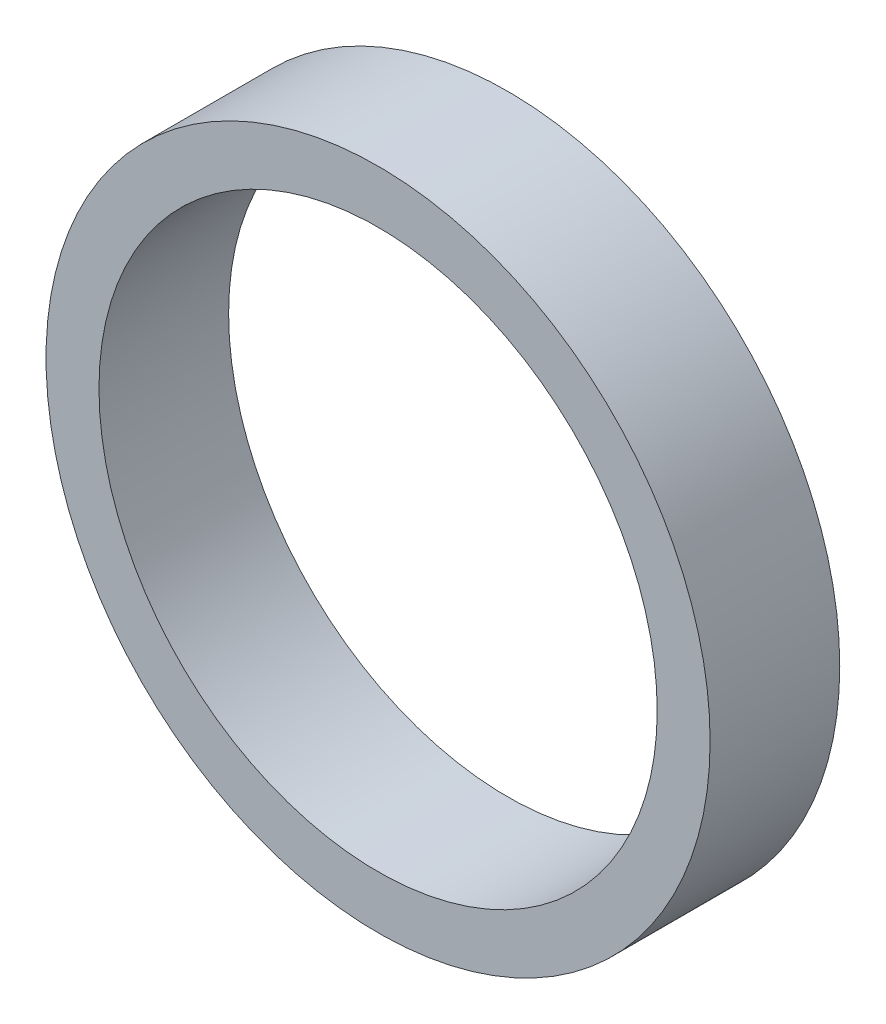
ISO-10303-21;
HEADER;
FILE_DESCRIPTION(('STEP AP214'),'2;1');
FILE_NAME('part.step','',(''),(''),'','','');
FILE_SCHEMA(('AUTOMOTIVE_DESIGN { 1 0 10303 214 1 1 1 1 }'));
ENDSEC;
DATA;
#1=APPLICATION_CONTEXT('core data for automotive mechanical design processes');
#2=APPLICATION_PROTOCOL_DEFINITION('international standard','automotive_design',2000,#1);
#3=PRODUCT_CONTEXT('',#1,'mechanical');
#4=PRODUCT('Part','Part','',(#3));
#5=PRODUCT_RELATED_PRODUCT_CATEGORY('part','',(#4));
#6=PRODUCT_DEFINITION_FORMATION('','',#4);
#7=PRODUCT_DEFINITION_CONTEXT('part definition',#1,'design');
#8=PRODUCT_DEFINITION('design','',#6,#7);
#9=PRODUCT_DEFINITION_SHAPE('','',#8);
#10=(LENGTH_UNIT() NAMED_UNIT(*) SI_UNIT(.MILLI.,.METRE.));
#11=(NAMED_UNIT(*) PLANE_ANGLE_UNIT() SI_UNIT($,.RADIAN.));
#12=(NAMED_UNIT(*) SI_UNIT($,.STERADIAN.) SOLID_ANGLE_UNIT());
#13=UNCERTAINTY_MEASURE_WITH_UNIT(LENGTH_MEASURE(1.E-05),#10,'distance_accuracy_value','');
#14=(GEOMETRIC_REPRESENTATION_CONTEXT(3) GLOBAL_UNCERTAINTY_ASSIGNED_CONTEXT((#13)) GLOBAL_UNIT_ASSIGNED_CONTEXT((#10,
#11,#12)) REPRESENTATION_CONTEXT('',''));
#15=CARTESIAN_POINT('',(0.,0.,0.));
#16=DIRECTION('',(0.,0.,1.));
#17=DIRECTION('',(1.,0.,0.));
#18=AXIS2_PLACEMENT_3D('',#15,#16,#17);
#19=CARTESIAN_POINT('',(0.,0.,4.9));
#20=DIRECTION('',(0.,0.,1.));
#21=DIRECTION('',(1.,0.,0.));
#22=AXIS2_PLACEMENT_3D('',#19,#20,#21);
#23=PLANE('',#22);
#24=CARTESIAN_POINT('',(0.,0.,4.9));
#25=DIRECTION('',(0.,0.,1.));
#26=DIRECTION('',(1.,0.,0.));
#27=AXIS2_PLACEMENT_3D('',#24,#25,#26);
#28=CIRCLE('',#27,12.55);
#29=CARTESIAN_POINT('',(12.55,0.,4.9));
#30=VERTEX_POINT('',#29);
#31=EDGE_CURVE('E11',#30,#30,#28,.T.);
#32=ORIENTED_EDGE('',*,*,#31,.T.);
#33=EDGE_LOOP('',(#32));
#34=FACE_BOUND('',#33,.T.);
#35=CARTESIAN_POINT('',(0.,0.,4.9));
#36=DIRECTION('',(0.,0.,1.));
#37=DIRECTION('',(1.,0.,0.));
#38=AXIS2_PLACEMENT_3D('',#35,#36,#37);
#39=CIRCLE('',#38,10.55);
#40=CARTESIAN_POINT('',(10.55,0.,4.9));
#41=VERTEX_POINT('',#40);
#42=EDGE_CURVE('E56',#41,#41,#39,.T.);
#43=ORIENTED_EDGE('',*,*,#42,.F.);
#44=EDGE_LOOP('',(#43));
#45=FACE_BOUND('',#44,.T.);
#46=ADVANCED_FACE('F45',(#34,#45),#23,.T.);
#47=CARTESIAN_POINT('',(0.,0.,0.));
#48=DIRECTION('',(0.,0.,1.));
#49=DIRECTION('',(1.,0.,0.));
#50=AXIS2_PLACEMENT_3D('',#47,#48,#49);
#51=PLANE('',#50);
#52=CARTESIAN_POINT('',(0.,0.,0.));
#53=DIRECTION('',(0.,0.,1.));
#54=DIRECTION('',(1.,0.,0.));
#55=AXIS2_PLACEMENT_3D('',#52,#53,#54);
#56=CIRCLE('',#55,12.55);
#57=CARTESIAN_POINT('',(12.55,0.,0.));
#58=VERTEX_POINT('',#57);
#59=EDGE_CURVE('E49',#58,#58,#56,.T.);
#60=ORIENTED_EDGE('',*,*,#59,.F.);
#61=EDGE_LOOP('',(#60));
#62=FACE_BOUND('',#61,.T.);
#63=CARTESIAN_POINT('',(0.,0.,0.));
#64=DIRECTION('',(0.,0.,1.));
#65=DIRECTION('',(1.,0.,0.));
#66=AXIS2_PLACEMENT_3D('',#63,#64,#65);
#67=CIRCLE('',#66,10.55);
#68=CARTESIAN_POINT('',(10.55,0.,0.));
#69=VERTEX_POINT('',#68);
#70=EDGE_CURVE('E58',#69,#69,#67,.T.);
#71=ORIENTED_EDGE('',*,*,#70,.T.);
#72=EDGE_LOOP('',(#71));
#73=FACE_BOUND('',#72,.T.);
#74=ADVANCED_FACE('F68',(#62,#73),#51,.F.);
#75=CARTESIAN_POINT('',(0.,0.,4.9));
#76=DIRECTION('',(0.,0.,-1.));
#77=DIRECTION('',(-1.,0.,0.));
#78=AXIS2_PLACEMENT_3D('',#75,#76,#77);
#79=CYLINDRICAL_SURFACE('',#78,12.55);
#80=ORIENTED_EDGE('',*,*,#31,.F.);
#81=EDGE_LOOP('',(#80));
#82=FACE_BOUND('',#81,.T.);
#83=ORIENTED_EDGE('',*,*,#59,.T.);
#84=EDGE_LOOP('',(#83));
#85=FACE_BOUND('',#84,.T.);
#86=ADVANCED_FACE('F47',(#82,#85),#79,.T.);
#87=CARTESIAN_POINT('',(0.,0.,4.9));
#88=DIRECTION('',(0.,0.,-1.));
#89=DIRECTION('',(-1.,0.,0.));
#90=AXIS2_PLACEMENT_3D('',#87,#88,#89);
#91=CYLINDRICAL_SURFACE('',#90,10.55);
#92=ORIENTED_EDGE('',*,*,#42,.T.);
#93=EDGE_LOOP('',(#92));
#94=FACE_BOUND('',#93,.T.);
#95=ORIENTED_EDGE('',*,*,#70,.F.);
#96=EDGE_LOOP('',(#95));
#97=FACE_BOUND('',#96,.T.);
#98=ADVANCED_FACE('F64',(#94,#97),#91,.F.);
#99=CLOSED_SHELL('',(#46,#74,#86,#98));
#100=MANIFOLD_SOLID_BREP('B2',#99);
#101=ADVANCED_BREP_SHAPE_REPRESENTATION('',(#18,#100),#14);
#102=SHAPE_DEFINITION_REPRESENTATION(#9,#101);
ENDSEC;
END-ISO-10303-21;
